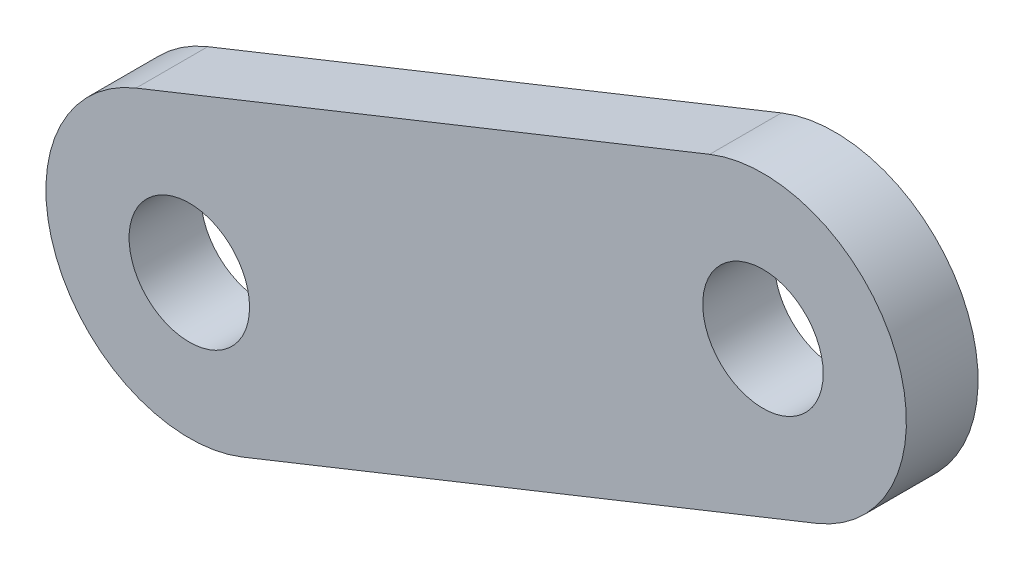
ISO-10303-21;
HEADER;
FILE_DESCRIPTION(('STEP AP214'),'2;1');
FILE_NAME('part.step','',(''),(''),'','','');
FILE_SCHEMA(('AUTOMOTIVE_DESIGN { 1 0 10303 214 1 1 1 1 }'));
ENDSEC;
DATA;
#1=APPLICATION_CONTEXT('core data for automotive mechanical design processes');
#2=APPLICATION_PROTOCOL_DEFINITION('international standard','automotive_design',2000,#1);
#3=PRODUCT_CONTEXT('',#1,'mechanical');
#4=PRODUCT('Part','Part','',(#3));
#5=PRODUCT_RELATED_PRODUCT_CATEGORY('part','',(#4));
#6=PRODUCT_DEFINITION_FORMATION('','',#4);
#7=PRODUCT_DEFINITION_CONTEXT('part definition',#1,'design');
#8=PRODUCT_DEFINITION('design','',#6,#7);
#9=PRODUCT_DEFINITION_SHAPE('','',#8);
#10=(LENGTH_UNIT() NAMED_UNIT(*) SI_UNIT(.MILLI.,.METRE.));
#11=(NAMED_UNIT(*) PLANE_ANGLE_UNIT() SI_UNIT($,.RADIAN.));
#12=(NAMED_UNIT(*) SI_UNIT($,.STERADIAN.) SOLID_ANGLE_UNIT());
#13=UNCERTAINTY_MEASURE_WITH_UNIT(LENGTH_MEASURE(1.E-05),#10,'distance_accuracy_value','');
#14=(GEOMETRIC_REPRESENTATION_CONTEXT(3) GLOBAL_UNCERTAINTY_ASSIGNED_CONTEXT((#13)) GLOBAL_UNIT_ASSIGNED_CONTEXT((#10,
#11,#12)) REPRESENTATION_CONTEXT('',''));
#15=CARTESIAN_POINT('',(0.,0.,0.));
#16=DIRECTION('',(0.,0.,1.));
#17=DIRECTION('',(1.,0.,0.));
#18=AXIS2_PLACEMENT_3D('',#15,#16,#17);
#19=CARTESIAN_POINT('',(-40.,-36.,68.9));
#20=DIRECTION('',(0.,0.,1.));
#21=DIRECTION('',(1.,0.,0.));
#22=AXIS2_PLACEMENT_3D('',#19,#20,#21);
#23=PLANE('',#22);
#24=CARTESIAN_POINT('',(-20.,-28.,68.9));
#25=DIRECTION('',(0.,0.,1.));
#26=DIRECTION('',(1.,0.,0.));
#27=AXIS2_PLACEMENT_3D('',#24,#25,#26);
#28=CIRCLE('',#27,2.1);
#29=CARTESIAN_POINT('',(-17.9,-28.,68.9));
#30=VERTEX_POINT('',#29);
#31=EDGE_CURVE('E100',#30,#30,#28,.T.);
#32=ORIENTED_EDGE('',*,*,#31,.F.);
#33=EDGE_LOOP('',(#32));
#34=FACE_BOUND('',#33,.T.);
#35=CARTESIAN_POINT('',(-40.,-36.,68.9));
#36=DIRECTION('',(0.,0.,1.));
#37=DIRECTION('',(1.,0.,0.));
#38=AXIS2_PLACEMENT_3D('',#35,#36,#37);
#39=CIRCLE('',#38,5.);
#40=CARTESIAN_POINT('',(-41.8569533817705,-31.3576165455737,68.9));
#41=VERTEX_POINT('',#40);
#42=CARTESIAN_POINT('',(-38.1430466182295,-40.6423834544263,68.9));
#43=VERTEX_POINT('',#42);
#44=EDGE_CURVE('E85',#41,#43,#39,.T.);
#45=ORIENTED_EDGE('',*,*,#44,.T.);
#46=DIRECTION('',(0.928476690885259,0.371390676354104,0.));
#47=VECTOR('',#46,1.);
#48=CARTESIAN_POINT('',(-38.1430466182295,-40.6423834544263,68.9));
#49=LINE('',#48,#47);
#50=CARTESIAN_POINT('',(-18.1430466182295,-32.6423834544263,68.9));
#51=VERTEX_POINT('',#50);
#52=EDGE_CURVE('E80',#43,#51,#49,.T.);
#53=ORIENTED_EDGE('',*,*,#52,.T.);
#54=CARTESIAN_POINT('',(-20.,-28.,68.9));
#55=DIRECTION('',(0.,0.,1.));
#56=DIRECTION('',(1.,0.,0.));
#57=AXIS2_PLACEMENT_3D('',#54,#55,#56);
#58=CIRCLE('',#57,5.);
#59=CARTESIAN_POINT('',(-21.8569533817705,-23.3576165455737,68.9));
#60=VERTEX_POINT('',#59);
#61=EDGE_CURVE('E83',#51,#60,#58,.T.);
#62=ORIENTED_EDGE('',*,*,#61,.T.);
#63=DIRECTION('',(-0.928476690885259,-0.371390676354104,0.));
#64=VECTOR('',#63,1.);
#65=CARTESIAN_POINT('',(-21.8569533817705,-23.3576165455737,68.9));
#66=LINE('',#65,#64);
#67=EDGE_CURVE('E50',#60,#41,#66,.T.);
#68=ORIENTED_EDGE('',*,*,#67,.T.);
#69=EDGE_LOOP('',(#45,#53,#62,#68));
#70=FACE_BOUND('',#69,.T.);
#71=CARTESIAN_POINT('',(-40.,-36.,68.9));
#72=DIRECTION('',(0.,0.,1.));
#73=DIRECTION('',(1.,0.,0.));
#74=AXIS2_PLACEMENT_3D('',#71,#72,#73);
#75=CIRCLE('',#74,2.1);
#76=CARTESIAN_POINT('',(-37.9,-36.,68.9));
#77=VERTEX_POINT('',#76);
#78=EDGE_CURVE('E115',#77,#77,#75,.T.);
#79=ORIENTED_EDGE('',*,*,#78,.F.);
#80=EDGE_LOOP('',(#79));
#81=FACE_BOUND('',#80,.T.);
#82=ADVANCED_FACE('F33',(#34,#70,#81),#23,.T.);
#83=CARTESIAN_POINT('',(-40.,-36.,66.4));
#84=DIRECTION('',(0.,0.,1.));
#85=DIRECTION('',(1.,0.,0.));
#86=AXIS2_PLACEMENT_3D('',#83,#84,#85);
#87=PLANE('',#86);
#88=CARTESIAN_POINT('',(-40.,-36.,66.4));
#89=DIRECTION('',(0.,0.,1.));
#90=DIRECTION('',(1.,0.,0.));
#91=AXIS2_PLACEMENT_3D('',#88,#89,#90);
#92=CIRCLE('',#91,5.);
#93=CARTESIAN_POINT('',(-41.8569533817705,-31.3576165455737,66.4));
#94=VERTEX_POINT('',#93);
#95=CARTESIAN_POINT('',(-38.1430466182295,-40.6423834544263,66.4));
#96=VERTEX_POINT('',#95);
#97=EDGE_CURVE('E97',#94,#96,#92,.T.);
#98=ORIENTED_EDGE('',*,*,#97,.F.);
#99=DIRECTION('',(-0.928476690885259,-0.371390676354104,0.));
#100=VECTOR('',#99,1.);
#101=CARTESIAN_POINT('',(-21.8569533817705,-23.3576165455737,66.4));
#102=LINE('',#101,#100);
#103=CARTESIAN_POINT('',(-21.8569533817705,-23.3576165455737,66.4));
#104=VERTEX_POINT('',#103);
#105=EDGE_CURVE('E73',#104,#94,#102,.T.);
#106=ORIENTED_EDGE('',*,*,#105,.F.);
#107=CARTESIAN_POINT('',(-20.,-28.,66.4));
#108=DIRECTION('',(0.,0.,1.));
#109=DIRECTION('',(1.,0.,0.));
#110=AXIS2_PLACEMENT_3D('',#107,#108,#109);
#111=CIRCLE('',#110,5.);
#112=CARTESIAN_POINT('',(-18.1430466182295,-32.6423834544263,66.4));
#113=VERTEX_POINT('',#112);
#114=EDGE_CURVE('E67',#113,#104,#111,.T.);
#115=ORIENTED_EDGE('',*,*,#114,.F.);
#116=DIRECTION('',(0.928476690885259,0.371390676354104,0.));
#117=VECTOR('',#116,1.);
#118=CARTESIAN_POINT('',(-38.1430466182295,-40.6423834544263,66.4));
#119=LINE('',#118,#117);
#120=EDGE_CURVE('E89',#96,#113,#119,.T.);
#121=ORIENTED_EDGE('',*,*,#120,.F.);
#122=EDGE_LOOP('',(#98,#106,#115,#121));
#123=FACE_BOUND('',#122,.T.);
#124=CARTESIAN_POINT('',(-20.,-28.,66.4));
#125=DIRECTION('',(0.,0.,1.));
#126=DIRECTION('',(1.,0.,0.));
#127=AXIS2_PLACEMENT_3D('',#124,#125,#126);
#128=CIRCLE('',#127,2.1);
#129=CARTESIAN_POINT('',(-17.9,-28.,66.4));
#130=VERTEX_POINT('',#129);
#131=EDGE_CURVE('E112',#130,#130,#128,.T.);
#132=ORIENTED_EDGE('',*,*,#131,.T.);
#133=EDGE_LOOP('',(#132));
#134=FACE_BOUND('',#133,.T.);
#135=CARTESIAN_POINT('',(-40.,-36.,66.4));
#136=DIRECTION('',(0.,0.,1.));
#137=DIRECTION('',(1.,0.,0.));
#138=AXIS2_PLACEMENT_3D('',#135,#136,#137);
#139=CIRCLE('',#138,2.1);
#140=CARTESIAN_POINT('',(-37.9,-36.,66.4));
#141=VERTEX_POINT('',#140);
#142=EDGE_CURVE('E118',#141,#141,#139,.T.);
#143=ORIENTED_EDGE('',*,*,#142,.T.);
#144=EDGE_LOOP('',(#143));
#145=FACE_BOUND('',#144,.T.);
#146=ADVANCED_FACE('F108',(#123,#134,#145),#87,.F.);
#147=CARTESIAN_POINT('',(-40.,-36.,68.9));
#148=DIRECTION('',(0.,0.,-1.));
#149=DIRECTION('',(-1.,0.,0.));
#150=AXIS2_PLACEMENT_3D('',#147,#148,#149);
#151=CYLINDRICAL_SURFACE('',#150,5.);
#152=ORIENTED_EDGE('',*,*,#97,.T.);
#153=DIRECTION('',(0.,0.,-1.));
#154=VECTOR('',#153,1.);
#155=CARTESIAN_POINT('',(-38.1430466182295,-40.6423834544263,68.9));
#156=LINE('',#155,#154);
#157=EDGE_CURVE('E11',#43,#96,#156,.T.);
#158=ORIENTED_EDGE('',*,*,#157,.F.);
#159=ORIENTED_EDGE('',*,*,#44,.F.);
#160=DIRECTION('',(0.,0.,-1.));
#161=VECTOR('',#160,1.);
#162=CARTESIAN_POINT('',(-41.8569533817705,-31.3576165455737,68.9));
#163=LINE('',#162,#161);
#164=EDGE_CURVE('E93',#41,#94,#163,.T.);
#165=ORIENTED_EDGE('',*,*,#164,.T.);
#166=EDGE_LOOP('',(#152,#158,#159,#165));
#167=FACE_BOUND('',#166,.T.);
#168=ADVANCED_FACE('F35',(#167),#151,.T.);
#169=CARTESIAN_POINT('',(-38.1430466182295,-40.6423834544263,68.9));
#170=DIRECTION('',(-0.371390676354104,0.928476690885259,0.));
#171=DIRECTION('',(-0.928476690885259,-0.371390676354104,0.));
#172=AXIS2_PLACEMENT_3D('',#169,#170,#171);
#173=PLANE('',#172);
#174=ORIENTED_EDGE('',*,*,#120,.T.);
#175=DIRECTION('',(0.,0.,-1.));
#176=VECTOR('',#175,1.);
#177=CARTESIAN_POINT('',(-18.1430466182295,-32.6423834544263,68.9));
#178=LINE('',#177,#176);
#179=EDGE_CURVE('E42',#51,#113,#178,.T.);
#180=ORIENTED_EDGE('',*,*,#179,.F.);
#181=ORIENTED_EDGE('',*,*,#52,.F.);
#182=ORIENTED_EDGE('',*,*,#157,.T.);
#183=EDGE_LOOP('',(#174,#180,#181,#182));
#184=FACE_BOUND('',#183,.T.);
#185=ADVANCED_FACE('F88',(#184),#173,.F.);
#186=CARTESIAN_POINT('',(-20.,-28.,68.9));
#187=DIRECTION('',(0.,0.,-1.));
#188=DIRECTION('',(-1.,0.,0.));
#189=AXIS2_PLACEMENT_3D('',#186,#187,#188);
#190=CYLINDRICAL_SURFACE('',#189,5.);
#191=ORIENTED_EDGE('',*,*,#114,.T.);
#192=DIRECTION('',(0.,0.,-1.));
#193=VECTOR('',#192,1.);
#194=CARTESIAN_POINT('',(-21.8569533817705,-23.3576165455737,68.9));
#195=LINE('',#194,#193);
#196=EDGE_CURVE('E90',#60,#104,#195,.T.);
#197=ORIENTED_EDGE('',*,*,#196,.F.);
#198=ORIENTED_EDGE('',*,*,#61,.F.);
#199=ORIENTED_EDGE('',*,*,#179,.T.);
#200=EDGE_LOOP('',(#191,#197,#198,#199));
#201=FACE_BOUND('',#200,.T.);
#202=ADVANCED_FACE('F91',(#201),#190,.T.);
#203=CARTESIAN_POINT('',(-21.8569533817705,-23.3576165455737,68.9));
#204=DIRECTION('',(0.371390676354104,-0.928476690885259,0.));
#205=DIRECTION('',(0.928476690885259,0.371390676354104,0.));
#206=AXIS2_PLACEMENT_3D('',#203,#204,#205);
#207=PLANE('',#206);
#208=ORIENTED_EDGE('',*,*,#105,.T.);
#209=ORIENTED_EDGE('',*,*,#164,.F.);
#210=ORIENTED_EDGE('',*,*,#67,.F.);
#211=ORIENTED_EDGE('',*,*,#196,.T.);
#212=EDGE_LOOP('',(#208,#209,#210,#211));
#213=FACE_BOUND('',#212,.T.);
#214=ADVANCED_FACE('F105',(#213),#207,.F.);
#215=CARTESIAN_POINT('',(-20.,-28.,68.9));
#216=DIRECTION('',(0.,0.,-1.));
#217=DIRECTION('',(-1.,0.,0.));
#218=AXIS2_PLACEMENT_3D('',#215,#216,#217);
#219=CYLINDRICAL_SURFACE('',#218,2.1);
#220=ORIENTED_EDGE('',*,*,#31,.T.);
#221=EDGE_LOOP('',(#220));
#222=FACE_BOUND('',#221,.T.);
#223=ORIENTED_EDGE('',*,*,#131,.F.);
#224=EDGE_LOOP('',(#223));
#225=FACE_BOUND('',#224,.T.);
#226=ADVANCED_FACE('F135',(#222,#225),#219,.F.);
#227=CARTESIAN_POINT('',(-40.,-36.,68.9));
#228=DIRECTION('',(0.,0.,-1.));
#229=DIRECTION('',(-1.,0.,0.));
#230=AXIS2_PLACEMENT_3D('',#227,#228,#229);
#231=CYLINDRICAL_SURFACE('',#230,2.1);
#232=ORIENTED_EDGE('',*,*,#78,.T.);
#233=EDGE_LOOP('',(#232));
#234=FACE_BOUND('',#233,.T.);
#235=ORIENTED_EDGE('',*,*,#142,.F.);
#236=EDGE_LOOP('',(#235));
#237=FACE_BOUND('',#236,.T.);
#238=ADVANCED_FACE('F124',(#234,#237),#231,.F.);
#239=CLOSED_SHELL('',(#82,#146,#168,#185,#202,#214,#226,#238));
#240=MANIFOLD_SOLID_BREP('B2',#239);
#241=ADVANCED_BREP_SHAPE_REPRESENTATION('',(#18,#240),#14);
#242=SHAPE_DEFINITION_REPRESENTATION(#9,#241);
ENDSEC;
END-ISO-10303-21;
